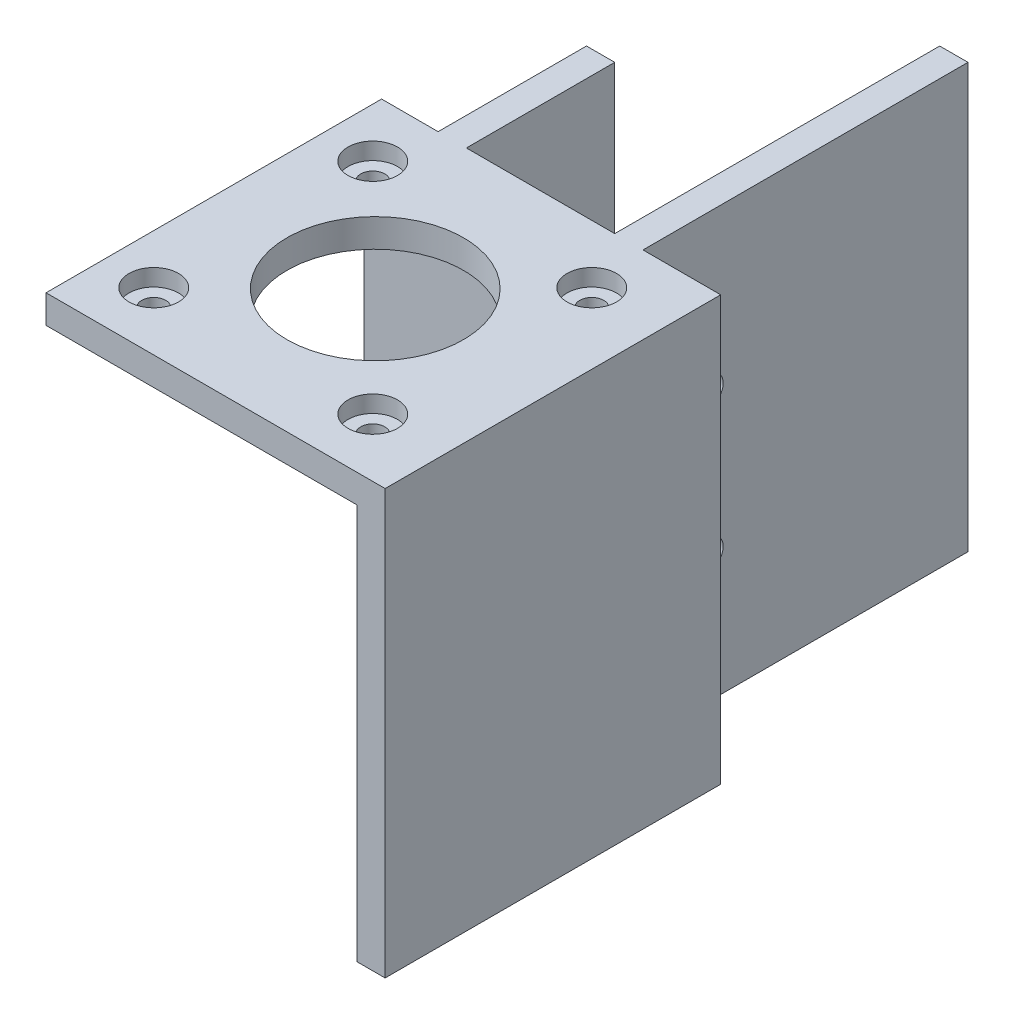
ISO-10303-21;
HEADER;
FILE_DESCRIPTION(('STEP AP214'),'2;1');
FILE_NAME('part.step','',(''),(''),'','','');
FILE_SCHEMA(('AUTOMOTIVE_DESIGN { 1 0 10303 214 1 1 1 1 }'));
ENDSEC;
DATA;
#1=APPLICATION_CONTEXT('core data for automotive mechanical design processes');
#2=APPLICATION_PROTOCOL_DEFINITION('international standard','automotive_design',2000,#1);
#3=PRODUCT_CONTEXT('',#1,'mechanical');
#4=PRODUCT('Part','Part','',(#3));
#5=PRODUCT_RELATED_PRODUCT_CATEGORY('part','',(#4));
#6=PRODUCT_DEFINITION_FORMATION('','',#4);
#7=PRODUCT_DEFINITION_CONTEXT('part definition',#1,'design');
#8=PRODUCT_DEFINITION('design','',#6,#7);
#9=PRODUCT_DEFINITION_SHAPE('','',#8);
#10=(LENGTH_UNIT() NAMED_UNIT(*) SI_UNIT(.MILLI.,.METRE.));
#11=(NAMED_UNIT(*) PLANE_ANGLE_UNIT() SI_UNIT($,.RADIAN.));
#12=(NAMED_UNIT(*) SI_UNIT($,.STERADIAN.) SOLID_ANGLE_UNIT());
#13=UNCERTAINTY_MEASURE_WITH_UNIT(LENGTH_MEASURE(1.E-05),#10,'distance_accuracy_value','');
#14=(GEOMETRIC_REPRESENTATION_CONTEXT(3) GLOBAL_UNCERTAINTY_ASSIGNED_CONTEXT((#13)) GLOBAL_UNIT_ASSIGNED_CONTEXT((#10,
#11,#12)) REPRESENTATION_CONTEXT('',''));
#15=CARTESIAN_POINT('',(0.,0.,0.));
#16=DIRECTION('',(0.,0.,1.));
#17=DIRECTION('',(1.,0.,0.));
#18=AXIS2_PLACEMENT_3D('',#15,#16,#17);
#19=CARTESIAN_POINT('',(0.,0.,0.));
#20=DIRECTION('',(0.,0.,1.));
#21=DIRECTION('',(1.,0.,0.));
#22=AXIS2_PLACEMENT_3D('',#19,#20,#21);
#23=PLANE('',#22);
#24=DIRECTION('',(1.,0.,0.));
#25=VECTOR('',#24,1.);
#26=CARTESIAN_POINT('',(-26.5243902439024,0.,0.));
#27=LINE('',#26,#25);
#28=CARTESIAN_POINT('',(-26.5243902439024,0.,0.));
#29=VERTEX_POINT('',#28);
#30=CARTESIAN_POINT('',(17.4756097560976,0.,0.));
#31=VERTEX_POINT('',#30);
#32=EDGE_CURVE('E48',#29,#31,#27,.T.);
#33=ORIENTED_EDGE('',*,*,#32,.T.);
#34=DIRECTION('',(0.,1.,0.));
#35=VECTOR('',#34,1.);
#36=CARTESIAN_POINT('',(17.4756097560976,0.,0.));
#37=LINE('',#36,#35);
#38=CARTESIAN_POINT('',(17.4756097560976,56.,0.));
#39=VERTEX_POINT('',#38);
#40=EDGE_CURVE('E175',#31,#39,#37,.T.);
#41=ORIENTED_EDGE('',*,*,#40,.T.);
#42=DIRECTION('',(1.,0.,0.));
#43=VECTOR('',#42,1.);
#44=CARTESIAN_POINT('',(-26.5243902439024,56.,0.));
#45=LINE('',#44,#43);
#46=CARTESIAN_POINT('',(-26.5243902439024,56.,0.));
#47=VERTEX_POINT('',#46);
#48=EDGE_CURVE('E314',#47,#39,#45,.T.);
#49=ORIENTED_EDGE('',*,*,#48,.F.);
#50=DIRECTION('',(0.,-1.,0.));
#51=VECTOR('',#50,1.);
#52=CARTESIAN_POINT('',(-26.5243902439024,60.,0.));
#53=LINE('',#52,#51);
#54=EDGE_CURVE('E330',#47,#29,#53,.T.);
#55=ORIENTED_EDGE('',*,*,#54,.T.);
#56=EDGE_LOOP('',(#33,#41,#49,#55));
#57=FACE_BOUND('',#56,.T.);
#58=ADVANCED_FACE('F33',(#57),#23,.T.);
#59=CARTESIAN_POINT('',(-26.5243902439024,56.,45.));
#60=DIRECTION('',(0.,1.,0.));
#61=DIRECTION('',(0.,0.,1.));
#62=AXIS2_PLACEMENT_3D('',#59,#60,#61);
#63=PLANE('',#62);
#64=CARTESIAN_POINT('',(-3.72439024390243,56.,21.2));
#65=DIRECTION('',(0.,1.,0.));
#66=DIRECTION('',(0.,0.,1.));
#67=AXIS2_PLACEMENT_3D('',#64,#65,#66);
#68=CIRCLE('',#67,12.5);
#69=CARTESIAN_POINT('',(-3.72439024390243,56.,33.7));
#70=VERTEX_POINT('',#69);
#71=EDGE_CURVE('E290',#70,#70,#68,.F.);
#72=ORIENTED_EDGE('',*,*,#71,.F.);
#73=EDGE_LOOP('',(#72));
#74=FACE_BOUND('',#73,.T.);
#75=CARTESIAN_POINT('',(-19.5243902439024,56.,5.75));
#76=DIRECTION('',(0.,1.,0.));
#77=DIRECTION('',(0.,0.,1.));
#78=AXIS2_PLACEMENT_3D('',#75,#76,#77);
#79=CIRCLE('',#78,1.7);
#80=CARTESIAN_POINT('',(-19.5243902439024,56.,7.45));
#81=VERTEX_POINT('',#80);
#82=EDGE_CURVE('E246',#81,#81,#79,.T.);
#83=ORIENTED_EDGE('',*,*,#82,.T.);
#84=EDGE_LOOP('',(#83));
#85=FACE_BOUND('',#84,.T.);
#86=CARTESIAN_POINT('',(11.4756097560976,56.,5.75));
#87=DIRECTION('',(0.,1.,0.));
#88=DIRECTION('',(0.,0.,1.));
#89=AXIS2_PLACEMENT_3D('',#86,#87,#88);
#90=CIRCLE('',#89,1.7);
#91=CARTESIAN_POINT('',(11.4756097560976,56.,7.45));
#92=VERTEX_POINT('',#91);
#93=EDGE_CURVE('E234',#92,#92,#90,.T.);
#94=ORIENTED_EDGE('',*,*,#93,.T.);
#95=EDGE_LOOP('',(#94));
#96=FACE_BOUND('',#95,.T.);
#97=CARTESIAN_POINT('',(-19.5243902439024,56.,36.75));
#98=DIRECTION('',(0.,1.,0.));
#99=DIRECTION('',(0.,0.,1.));
#100=AXIS2_PLACEMENT_3D('',#97,#98,#99);
#101=CIRCLE('',#100,1.7);
#102=CARTESIAN_POINT('',(-19.5243902439024,56.,38.45));
#103=VERTEX_POINT('',#102);
#104=EDGE_CURVE('E222',#103,#103,#101,.T.);
#105=ORIENTED_EDGE('',*,*,#104,.T.);
#106=EDGE_LOOP('',(#105));
#107=FACE_BOUND('',#106,.T.);
#108=CARTESIAN_POINT('',(11.4756097560976,56.,36.75));
#109=DIRECTION('',(0.,1.,0.));
#110=DIRECTION('',(0.,0.,1.));
#111=AXIS2_PLACEMENT_3D('',#108,#109,#110);
#112=CIRCLE('',#111,1.7);
#113=CARTESIAN_POINT('',(11.4756097560976,56.,38.45));
#114=VERTEX_POINT('',#113);
#115=EDGE_CURVE('E210',#114,#114,#112,.T.);
#116=ORIENTED_EDGE('',*,*,#115,.T.);
#117=EDGE_LOOP('',(#116));
#118=FACE_BOUND('',#117,.T.);
#119=DIRECTION('',(0.,0.,-1.));
#120=VECTOR('',#119,1.);
#121=CARTESIAN_POINT('',(17.4756097560976,56.,45.));
#122=LINE('',#121,#120);
#123=CARTESIAN_POINT('',(17.4756097560975,56.,45.));
#124=VERTEX_POINT('',#123);
#125=EDGE_CURVE('E56',#124,#39,#122,.T.);
#126=ORIENTED_EDGE('',*,*,#125,.F.);
#127=DIRECTION('',(1.,0.,0.));
#128=VECTOR('',#127,1.);
#129=CARTESIAN_POINT('',(-26.5243902439024,56.,45.));
#130=LINE('',#129,#128);
#131=CARTESIAN_POINT('',(-26.5243902439024,56.,45.));
#132=VERTEX_POINT('',#131);
#133=EDGE_CURVE('E322',#132,#124,#130,.T.);
#134=ORIENTED_EDGE('',*,*,#133,.F.);
#135=DIRECTION('',(0.,0.,-1.));
#136=VECTOR('',#135,1.);
#137=CARTESIAN_POINT('',(-26.5243902439024,56.,45.));
#138=LINE('',#137,#136);
#139=EDGE_CURVE('E326',#132,#47,#138,.T.);
#140=ORIENTED_EDGE('',*,*,#139,.T.);
#141=ORIENTED_EDGE('',*,*,#48,.T.);
#142=EDGE_LOOP('',(#126,#134,#140,#141));
#143=FACE_BOUND('',#142,.T.);
#144=ADVANCED_FACE('F357',(#74,#85,#96,#107,#118,#143),#63,.F.);
#145=CARTESIAN_POINT('',(-14.5243902439024,60.,-2.5));
#146=DIRECTION('',(-1.,0.,0.));
#147=DIRECTION('',(0.,0.,1.));
#148=AXIS2_PLACEMENT_3D('',#145,#146,#147);
#149=PLANE('',#148);
#150=DIRECTION('',(0.,0.,-1.));
#151=VECTOR('',#150,1.);
#152=CARTESIAN_POINT('',(-14.5243902439024,0.,-2.5));
#153=LINE('',#152,#151);
#154=CARTESIAN_POINT('',(-14.5243902439024,0.,-2.5));
#155=VERTEX_POINT('',#154);
#156=CARTESIAN_POINT('',(-14.5243902439024,0.,-23.5));
#157=VERTEX_POINT('',#156);
#158=EDGE_CURVE('E293',#155,#157,#153,.T.);
#159=ORIENTED_EDGE('',*,*,#158,.T.);
#160=DIRECTION('',(0.,-1.,0.));
#161=VECTOR('',#160,1.);
#162=CARTESIAN_POINT('',(-14.5243902439024,60.,-23.5));
#163=LINE('',#162,#161);
#164=CARTESIAN_POINT('',(-14.5243902439024,60.,-23.5));
#165=VERTEX_POINT('',#164);
#166=EDGE_CURVE('E304',#165,#157,#163,.T.);
#167=ORIENTED_EDGE('',*,*,#166,.F.);
#168=DIRECTION('',(0.,0.,-1.));
#169=VECTOR('',#168,1.);
#170=CARTESIAN_POINT('',(-14.5243902439024,60.,-2.5));
#171=LINE('',#170,#169);
#172=CARTESIAN_POINT('',(-14.5243902439024,60.,-2.5));
#173=VERTEX_POINT('',#172);
#174=EDGE_CURVE('E294',#173,#165,#171,.T.);
#175=ORIENTED_EDGE('',*,*,#174,.F.);
#176=DIRECTION('',(0.,-1.,0.));
#177=VECTOR('',#176,1.);
#178=CARTESIAN_POINT('',(-14.5243902439024,60.,-2.5));
#179=LINE('',#178,#177);
#180=EDGE_CURVE('E312',#173,#155,#179,.T.);
#181=ORIENTED_EDGE('',*,*,#180,.T.);
#182=EDGE_LOOP('',(#159,#167,#175,#181));
#183=FACE_BOUND('',#182,.T.);
#184=CARTESIAN_POINT('',(-14.5243902439024,18.,-11.75));
#185=DIRECTION('',(-1.,0.,0.));
#186=DIRECTION('',(0.,0.,1.));
#187=AXIS2_PLACEMENT_3D('',#184,#185,#186);
#188=CIRCLE('',#187,2.1);
#189=CARTESIAN_POINT('',(-14.5243902439024,18.,-9.65));
#190=VERTEX_POINT('',#189);
#191=EDGE_CURVE('E189',#190,#190,#188,.F.);
#192=ORIENTED_EDGE('',*,*,#191,.F.);
#193=EDGE_LOOP('',(#192));
#194=FACE_BOUND('',#193,.T.);
#195=CARTESIAN_POINT('',(-14.5243902439024,38.,-11.75));
#196=DIRECTION('',(-1.,0.,0.));
#197=DIRECTION('',(0.,0.,1.));
#198=AXIS2_PLACEMENT_3D('',#195,#196,#197);
#199=CIRCLE('',#198,2.1);
#200=CARTESIAN_POINT('',(-14.5243902439024,38.,-9.65));
#201=VERTEX_POINT('',#200);
#202=EDGE_CURVE('E198',#201,#201,#199,.T.);
#203=ORIENTED_EDGE('',*,*,#202,.T.);
#204=EDGE_LOOP('',(#203));
#205=FACE_BOUND('',#204,.T.);
#206=ADVANCED_FACE('F362',(#183,#194,#205),#149,.F.);
#207=CARTESIAN_POINT('',(6.47560975609757,60.,-2.5));
#208=DIRECTION('',(1.,0.,0.));
#209=DIRECTION('',(0.,0.,-1.));
#210=AXIS2_PLACEMENT_3D('',#207,#208,#209);
#211=PLANE('',#210);
#212=DIRECTION('',(0.,0.,1.));
#213=VECTOR('',#212,1.);
#214=CARTESIAN_POINT('',(6.47560975609757,0.,-2.5));
#215=LINE('',#214,#213);
#216=CARTESIAN_POINT('',(6.47560975609756,0.,-48.5));
#217=VERTEX_POINT('',#216);
#218=CARTESIAN_POINT('',(6.47560975609757,0.,-2.5));
#219=VERTEX_POINT('',#218);
#220=EDGE_CURVE('E307',#217,#219,#215,.T.);
#221=ORIENTED_EDGE('',*,*,#220,.T.);
#222=DIRECTION('',(0.,-1.,0.));
#223=VECTOR('',#222,1.);
#224=CARTESIAN_POINT('',(6.47560975609757,60.,-2.5));
#225=LINE('',#224,#223);
#226=CARTESIAN_POINT('',(6.47560975609757,60.,-2.5));
#227=VERTEX_POINT('',#226);
#228=EDGE_CURVE('E315',#227,#219,#225,.T.);
#229=ORIENTED_EDGE('',*,*,#228,.F.);
#230=DIRECTION('',(0.,0.,1.));
#231=VECTOR('',#230,1.);
#232=CARTESIAN_POINT('',(6.47560975609757,60.,-2.5));
#233=LINE('',#232,#231);
#234=CARTESIAN_POINT('',(6.47560975609756,60.,-48.5));
#235=VERTEX_POINT('',#234);
#236=EDGE_CURVE('E297',#235,#227,#233,.T.);
#237=ORIENTED_EDGE('',*,*,#236,.F.);
#238=DIRECTION('',(0.,1.,0.));
#239=VECTOR('',#238,1.);
#240=CARTESIAN_POINT('',(6.47560975609756,60.,-48.5));
#241=LINE('',#240,#239);
#242=EDGE_CURVE('E249',#217,#235,#241,.T.);
#243=ORIENTED_EDGE('',*,*,#242,.F.);
#244=EDGE_LOOP('',(#221,#229,#237,#243));
#245=FACE_BOUND('',#244,.T.);
#246=CARTESIAN_POINT('',(6.47560975609757,18.,-11.75));
#247=DIRECTION('',(1.,0.,0.));
#248=DIRECTION('',(0.,0.,-1.));
#249=AXIS2_PLACEMENT_3D('',#246,#247,#248);
#250=CIRCLE('',#249,2.1);
#251=CARTESIAN_POINT('',(6.47560975609757,18.,-13.85));
#252=VERTEX_POINT('',#251);
#253=EDGE_CURVE('E186',#252,#252,#250,.F.);
#254=ORIENTED_EDGE('',*,*,#253,.F.);
#255=EDGE_LOOP('',(#254));
#256=FACE_BOUND('',#255,.T.);
#257=CARTESIAN_POINT('',(6.47560975609757,38.,-11.75));
#258=DIRECTION('',(1.,0.,0.));
#259=DIRECTION('',(0.,0.,-1.));
#260=AXIS2_PLACEMENT_3D('',#257,#258,#259);
#261=CIRCLE('',#260,2.1);
#262=CARTESIAN_POINT('',(6.47560975609757,38.,-13.85));
#263=VERTEX_POINT('',#262);
#264=EDGE_CURVE('E195',#263,#263,#261,.T.);
#265=ORIENTED_EDGE('',*,*,#264,.T.);
#266=EDGE_LOOP('',(#265));
#267=FACE_BOUND('',#266,.T.);
#268=ADVANCED_FACE('F414',(#245,#256,#267),#211,.F.);
#269=CARTESIAN_POINT('',(10.4756097560976,0.,0.));
#270=DIRECTION('',(1.,0.,0.));
#271=DIRECTION('',(0.,1.,0.));
#272=AXIS2_PLACEMENT_3D('',#269,#270,#271);
#273=PLANE('',#272);
#274=CARTESIAN_POINT('',(10.4756097560976,18.,-11.75));
#275=DIRECTION('',(1.,0.,0.));
#276=DIRECTION('',(0.,1.,0.));
#277=AXIS2_PLACEMENT_3D('',#274,#275,#276);
#278=CIRCLE('',#277,2.1);
#279=CARTESIAN_POINT('',(10.4756097560976,20.1,-11.75));
#280=VERTEX_POINT('',#279);
#281=EDGE_CURVE('E181',#280,#280,#278,.F.);
#282=ORIENTED_EDGE('',*,*,#281,.T.);
#283=EDGE_LOOP('',(#282));
#284=FACE_BOUND('',#283,.T.);
#285=DIRECTION('',(0.,0.,-1.));
#286=VECTOR('',#285,1.);
#287=CARTESIAN_POINT('',(10.4756097560976,60.,-2.5));
#288=LINE('',#287,#286);
#289=CARTESIAN_POINT('',(10.4756097560976,60.,-2.5));
#290=VERTEX_POINT('',#289);
#291=CARTESIAN_POINT('',(10.4756097560975,60.,-48.5));
#292=VERTEX_POINT('',#291);
#293=EDGE_CURVE('E276',#290,#292,#288,.T.);
#294=ORIENTED_EDGE('',*,*,#293,.F.);
#295=DIRECTION('',(0.,1.,0.));
#296=VECTOR('',#295,1.);
#297=CARTESIAN_POINT('',(10.4756097560976,0.,-2.5));
#298=LINE('',#297,#296);
#299=CARTESIAN_POINT('',(10.4756097560976,0.,-2.5));
#300=VERTEX_POINT('',#299);
#301=EDGE_CURVE('E282',#300,#290,#298,.T.);
#302=ORIENTED_EDGE('',*,*,#301,.F.);
#303=DIRECTION('',(0.,0.,-1.));
#304=VECTOR('',#303,1.);
#305=CARTESIAN_POINT('',(10.4756097560976,0.,-2.5));
#306=LINE('',#305,#304);
#307=CARTESIAN_POINT('',(10.4756097560975,0.,-48.5));
#308=VERTEX_POINT('',#307);
#309=EDGE_CURVE('E280',#300,#308,#306,.T.);
#310=ORIENTED_EDGE('',*,*,#309,.T.);
#311=DIRECTION('',(0.,-1.,0.));
#312=VECTOR('',#311,1.);
#313=CARTESIAN_POINT('',(10.4756097560975,60.,-48.5));
#314=LINE('',#313,#312);
#315=EDGE_CURVE('E255',#292,#308,#314,.T.);
#316=ORIENTED_EDGE('',*,*,#315,.F.);
#317=EDGE_LOOP('',(#294,#302,#310,#316));
#318=FACE_BOUND('',#317,.T.);
#319=CARTESIAN_POINT('',(10.4756097560976,38.,-11.75));
#320=DIRECTION('',(1.,0.,0.));
#321=DIRECTION('',(0.,1.,0.));
#322=AXIS2_PLACEMENT_3D('',#319,#320,#321);
#323=CIRCLE('',#322,2.1);
#324=CARTESIAN_POINT('',(10.4756097560976,40.1,-11.75));
#325=VERTEX_POINT('',#324);
#326=EDGE_CURVE('E192',#325,#325,#323,.T.);
#327=ORIENTED_EDGE('',*,*,#326,.F.);
#328=EDGE_LOOP('',(#327));
#329=FACE_BOUND('',#328,.T.);
#330=ADVANCED_FACE('F407',(#284,#318,#329),#273,.T.);
#331=CARTESIAN_POINT('',(-18.5243902439024,0.,0.));
#332=DIRECTION('',(-1.,0.,0.));
#333=DIRECTION('',(0.,-1.,0.));
#334=AXIS2_PLACEMENT_3D('',#331,#332,#333);
#335=PLANE('',#334);
#336=CARTESIAN_POINT('',(-18.5243902439024,18.,-11.75));
#337=DIRECTION('',(1.,0.,0.));
#338=DIRECTION('',(0.,1.,0.));
#339=AXIS2_PLACEMENT_3D('',#336,#337,#338);
#340=CIRCLE('',#339,2.1);
#341=CARTESIAN_POINT('',(-18.5243902439024,20.1,-11.75));
#342=VERTEX_POINT('',#341);
#343=EDGE_CURVE('E177',#342,#342,#340,.T.);
#344=ORIENTED_EDGE('',*,*,#343,.T.);
#345=EDGE_LOOP('',(#344));
#346=FACE_BOUND('',#345,.T.);
#347=DIRECTION('',(0.,-1.,0.));
#348=VECTOR('',#347,1.);
#349=CARTESIAN_POINT('',(-18.5243902439024,0.,-2.5));
#350=LINE('',#349,#348);
#351=CARTESIAN_POINT('',(-18.5243902439024,60.,-2.5));
#352=VERTEX_POINT('',#351);
#353=CARTESIAN_POINT('',(-18.5243902439024,0.,-2.5));
#354=VERTEX_POINT('',#353);
#355=EDGE_CURVE('E262',#352,#354,#350,.T.);
#356=ORIENTED_EDGE('',*,*,#355,.F.);
#357=DIRECTION('',(0.,0.,-1.));
#358=VECTOR('',#357,1.);
#359=CARTESIAN_POINT('',(-18.5243902439024,60.,0.));
#360=LINE('',#359,#358);
#361=CARTESIAN_POINT('',(-18.5243902439024,60.,-23.5));
#362=VERTEX_POINT('',#361);
#363=EDGE_CURVE('E264',#352,#362,#360,.T.);
#364=ORIENTED_EDGE('',*,*,#363,.T.);
#365=DIRECTION('',(0.,-1.,0.));
#366=VECTOR('',#365,1.);
#367=CARTESIAN_POINT('',(-18.5243902439024,0.,-23.5));
#368=LINE('',#367,#366);
#369=CARTESIAN_POINT('',(-18.5243902439024,0.,-23.5));
#370=VERTEX_POINT('',#369);
#371=EDGE_CURVE('E266',#362,#370,#368,.T.);
#372=ORIENTED_EDGE('',*,*,#371,.T.);
#373=DIRECTION('',(0.,0.,1.));
#374=VECTOR('',#373,1.);
#375=CARTESIAN_POINT('',(-18.5243902439024,0.,0.));
#376=LINE('',#375,#374);
#377=EDGE_CURVE('E268',#370,#354,#376,.T.);
#378=ORIENTED_EDGE('',*,*,#377,.T.);
#379=EDGE_LOOP('',(#356,#364,#372,#378));
#380=FACE_BOUND('',#379,.T.);
#381=CARTESIAN_POINT('',(-18.5243902439024,38.,-11.75));
#382=DIRECTION('',(-1.,0.,0.));
#383=DIRECTION('',(0.,-1.,0.));
#384=AXIS2_PLACEMENT_3D('',#381,#382,#383);
#385=CIRCLE('',#384,2.1);
#386=CARTESIAN_POINT('',(-18.5243902439024,35.9,-11.75));
#387=VERTEX_POINT('',#386);
#388=EDGE_CURVE('E178',#387,#387,#385,.T.);
#389=ORIENTED_EDGE('',*,*,#388,.F.);
#390=EDGE_LOOP('',(#389));
#391=FACE_BOUND('',#390,.T.);
#392=ADVANCED_FACE('F370',(#346,#380,#391),#335,.T.);
#393=CARTESIAN_POINT('',(-26.5243902439024,60.,-23.5));
#394=DIRECTION('',(0.,1.,0.));
#395=DIRECTION('',(0.,0.,1.));
#396=AXIS2_PLACEMENT_3D('',#393,#394,#395);
#397=PLANE('',#396);
#398=DIRECTION('',(0.,0.,1.));
#399=VECTOR('',#398,1.);
#400=CARTESIAN_POINT('',(21.4756097560976,60.,45.));
#401=LINE('',#400,#399);
#402=CARTESIAN_POINT('',(21.4756097560976,60.,-2.5));
#403=VERTEX_POINT('',#402);
#404=CARTESIAN_POINT('',(21.4756097560976,60.,45.));
#405=VERTEX_POINT('',#404);
#406=EDGE_CURVE('E167',#403,#405,#401,.T.);
#407=ORIENTED_EDGE('',*,*,#406,.F.);
#408=DIRECTION('',(1.,0.,0.));
#409=VECTOR('',#408,1.);
#410=CARTESIAN_POINT('',(10.4756097560976,60.,-2.5));
#411=LINE('',#410,#409);
#412=EDGE_CURVE('E284',#290,#403,#411,.T.);
#413=ORIENTED_EDGE('',*,*,#412,.F.);
#414=ORIENTED_EDGE('',*,*,#293,.T.);
#415=DIRECTION('',(1.,0.,0.));
#416=VECTOR('',#415,1.);
#417=CARTESIAN_POINT('',(6.47560975609756,60.,-48.5));
#418=LINE('',#417,#416);
#419=EDGE_CURVE('E252',#235,#292,#418,.T.);
#420=ORIENTED_EDGE('',*,*,#419,.F.);
#421=ORIENTED_EDGE('',*,*,#236,.T.);
#422=DIRECTION('',(-1.,0.,0.));
#423=VECTOR('',#422,1.);
#424=CARTESIAN_POINT('',(-14.5243902439024,60.,-2.5));
#425=LINE('',#424,#423);
#426=EDGE_CURVE('E301',#227,#173,#425,.T.);
#427=ORIENTED_EDGE('',*,*,#426,.T.);
#428=ORIENTED_EDGE('',*,*,#174,.T.);
#429=DIRECTION('',(-1.,0.,0.));
#430=VECTOR('',#429,1.);
#431=CARTESIAN_POINT('',(-26.5243902439024,60.,-23.5));
#432=LINE('',#431,#430);
#433=EDGE_CURVE('E333',#165,#362,#432,.T.);
#434=ORIENTED_EDGE('',*,*,#433,.T.);
#435=ORIENTED_EDGE('',*,*,#363,.F.);
#436=DIRECTION('',(-1.,0.,0.));
#437=VECTOR('',#436,1.);
#438=CARTESIAN_POINT('',(-18.5243902439024,60.,-2.5));
#439=LINE('',#438,#437);
#440=CARTESIAN_POINT('',(-26.5243902439024,60.,-2.5));
#441=VERTEX_POINT('',#440);
#442=EDGE_CURVE('E271',#352,#441,#439,.T.);
#443=ORIENTED_EDGE('',*,*,#442,.T.);
#444=DIRECTION('',(0.,0.,1.));
#445=VECTOR('',#444,1.);
#446=CARTESIAN_POINT('',(-26.5243902439024,60.,-23.5));
#447=LINE('',#446,#445);
#448=CARTESIAN_POINT('',(-26.5243902439024,60.,45.));
#449=VERTEX_POINT('',#448);
#450=EDGE_CURVE('E11',#441,#449,#447,.T.);
#451=ORIENTED_EDGE('',*,*,#450,.T.);
#452=DIRECTION('',(-1.,0.,0.));
#453=VECTOR('',#452,1.);
#454=CARTESIAN_POINT('',(-26.5243902439024,60.,45.));
#455=LINE('',#454,#453);
#456=EDGE_CURVE('E324',#405,#449,#455,.T.);
#457=ORIENTED_EDGE('',*,*,#456,.F.);
#458=EDGE_LOOP('',(#407,#413,#414,#420,#421,#427,#428,#434,#435,#443,#451,#457));
#459=FACE_BOUND('',#458,.T.);
#460=CARTESIAN_POINT('',(11.4756097560976,60.,36.75));
#461=DIRECTION('',(0.,1.,0.));
#462=DIRECTION('',(0.,0.,1.));
#463=AXIS2_PLACEMENT_3D('',#460,#461,#462);
#464=CIRCLE('',#463,3.5);
#465=CARTESIAN_POINT('',(11.4756097560976,60.,40.25));
#466=VERTEX_POINT('',#465);
#467=EDGE_CURVE('E201',#466,#466,#464,.T.);
#468=ORIENTED_EDGE('',*,*,#467,.F.);
#469=EDGE_LOOP('',(#468));
#470=FACE_BOUND('',#469,.T.);
#471=CARTESIAN_POINT('',(-19.5243902439024,60.,36.75));
#472=DIRECTION('',(0.,1.,0.));
#473=DIRECTION('',(0.,0.,1.));
#474=AXIS2_PLACEMENT_3D('',#471,#472,#473);
#475=CIRCLE('',#474,3.5);
#476=CARTESIAN_POINT('',(-19.5243902439024,60.,40.25));
#477=VERTEX_POINT('',#476);
#478=EDGE_CURVE('E213',#477,#477,#475,.T.);
#479=ORIENTED_EDGE('',*,*,#478,.F.);
#480=EDGE_LOOP('',(#479));
#481=FACE_BOUND('',#480,.T.);
#482=CARTESIAN_POINT('',(11.4756097560976,60.,5.75));
#483=DIRECTION('',(0.,1.,0.));
#484=DIRECTION('',(0.,0.,1.));
#485=AXIS2_PLACEMENT_3D('',#482,#483,#484);
#486=CIRCLE('',#485,3.5);
#487=CARTESIAN_POINT('',(11.4756097560976,60.,9.25));
#488=VERTEX_POINT('',#487);
#489=EDGE_CURVE('E225',#488,#488,#486,.T.);
#490=ORIENTED_EDGE('',*,*,#489,.F.);
#491=EDGE_LOOP('',(#490));
#492=FACE_BOUND('',#491,.T.);
#493=CARTESIAN_POINT('',(-19.5243902439024,60.,5.75));
#494=DIRECTION('',(0.,1.,0.));
#495=DIRECTION('',(0.,0.,1.));
#496=AXIS2_PLACEMENT_3D('',#493,#494,#495);
#497=CIRCLE('',#496,3.5);
#498=CARTESIAN_POINT('',(-19.5243902439024,60.,9.25));
#499=VERTEX_POINT('',#498);
#500=EDGE_CURVE('E237',#499,#499,#497,.T.);
#501=ORIENTED_EDGE('',*,*,#500,.F.);
#502=EDGE_LOOP('',(#501));
#503=FACE_BOUND('',#502,.T.);
#504=CARTESIAN_POINT('',(-3.72439024390243,60.,21.2));
#505=DIRECTION('',(0.,1.,0.));
#506=DIRECTION('',(0.,0.,1.));
#507=AXIS2_PLACEMENT_3D('',#504,#505,#506);
#508=CIRCLE('',#507,12.5);
#509=CARTESIAN_POINT('',(-3.72439024390243,60.,33.7));
#510=VERTEX_POINT('',#509);
#511=EDGE_CURVE('E287',#510,#510,#508,.T.);
#512=ORIENTED_EDGE('',*,*,#511,.F.);
#513=EDGE_LOOP('',(#512));
#514=FACE_BOUND('',#513,.T.);
#515=ADVANCED_FACE('F368',(#459,#470,#481,#492,#503,#514),#397,.T.);
#516=CARTESIAN_POINT('',(-26.5243902439024,0.,-23.5));
#517=DIRECTION('',(0.,-1.,0.));
#518=DIRECTION('',(0.,0.,-1.));
#519=AXIS2_PLACEMENT_3D('',#516,#517,#518);
#520=PLANE('',#519);
#521=DIRECTION('',(0.,0.,-1.));
#522=VECTOR('',#521,1.);
#523=CARTESIAN_POINT('',(17.4756097560976,0.,45.));
#524=LINE('',#523,#522);
#525=CARTESIAN_POINT('',(17.4756097560976,0.,45.));
#526=VERTEX_POINT('',#525);
#527=EDGE_CURVE('E152',#526,#31,#524,.T.);
#528=ORIENTED_EDGE('',*,*,#527,.T.);
#529=ORIENTED_EDGE('',*,*,#32,.F.);
#530=DIRECTION('',(0.,0.,1.));
#531=VECTOR('',#530,1.);
#532=CARTESIAN_POINT('',(-26.5243902439024,0.,-23.5));
#533=LINE('',#532,#531);
#534=CARTESIAN_POINT('',(-26.5243902439024,0.,-2.5));
#535=VERTEX_POINT('',#534);
#536=EDGE_CURVE('E37',#535,#29,#533,.T.);
#537=ORIENTED_EDGE('',*,*,#536,.F.);
#538=DIRECTION('',(-1.,0.,0.));
#539=VECTOR('',#538,1.);
#540=CARTESIAN_POINT('',(-18.5243902439024,0.,-2.5));
#541=LINE('',#540,#539);
#542=EDGE_CURVE('E274',#354,#535,#541,.T.);
#543=ORIENTED_EDGE('',*,*,#542,.F.);
#544=ORIENTED_EDGE('',*,*,#377,.F.);
#545=DIRECTION('',(1.,0.,0.));
#546=VECTOR('',#545,1.);
#547=CARTESIAN_POINT('',(-26.5243902439024,0.,-23.5));
#548=LINE('',#547,#546);
#549=EDGE_CURVE('E331',#370,#157,#548,.T.);
#550=ORIENTED_EDGE('',*,*,#549,.T.);
#551=ORIENTED_EDGE('',*,*,#158,.F.);
#552=DIRECTION('',(-1.,0.,0.));
#553=VECTOR('',#552,1.);
#554=CARTESIAN_POINT('',(-14.5243902439024,0.,-2.5));
#555=LINE('',#554,#553);
#556=EDGE_CURVE('E298',#219,#155,#555,.T.);
#557=ORIENTED_EDGE('',*,*,#556,.F.);
#558=ORIENTED_EDGE('',*,*,#220,.F.);
#559=DIRECTION('',(-1.,0.,0.));
#560=VECTOR('',#559,1.);
#561=CARTESIAN_POINT('',(6.47560975609756,0.,-48.5));
#562=LINE('',#561,#560);
#563=EDGE_CURVE('E258',#308,#217,#562,.T.);
#564=ORIENTED_EDGE('',*,*,#563,.F.);
#565=ORIENTED_EDGE('',*,*,#309,.F.);
#566=DIRECTION('',(1.,0.,0.));
#567=VECTOR('',#566,1.);
#568=CARTESIAN_POINT('',(10.4756097560976,0.,-2.5));
#569=LINE('',#568,#567);
#570=CARTESIAN_POINT('',(21.4756097560976,0.,-2.5));
#571=VERTEX_POINT('',#570);
#572=EDGE_CURVE('E158',#300,#571,#569,.T.);
#573=ORIENTED_EDGE('',*,*,#572,.T.);
#574=DIRECTION('',(0.,0.,-1.));
#575=VECTOR('',#574,1.);
#576=CARTESIAN_POINT('',(21.4756097560976,0.,45.));
#577=LINE('',#576,#575);
#578=CARTESIAN_POINT('',(21.4756097560976,0.,45.));
#579=VERTEX_POINT('',#578);
#580=EDGE_CURVE('E155',#579,#571,#577,.T.);
#581=ORIENTED_EDGE('',*,*,#580,.F.);
#582=DIRECTION('',(1.,0.,0.));
#583=VECTOR('',#582,1.);
#584=CARTESIAN_POINT('',(17.4756097560976,0.,45.));
#585=LINE('',#584,#583);
#586=EDGE_CURVE('E142',#526,#579,#585,.T.);
#587=ORIENTED_EDGE('',*,*,#586,.F.);
#588=EDGE_LOOP('',(#528,#529,#537,#543,#544,#550,#551,#557,#558,#564,#565,#573,#581,#587));
#589=FACE_BOUND('',#588,.T.);
#590=ADVANCED_FACE('F156',(#589),#520,.T.);
#591=CARTESIAN_POINT('',(0.,0.,-23.5));
#592=DIRECTION('',(0.,0.,1.));
#593=DIRECTION('',(1.,0.,0.));
#594=AXIS2_PLACEMENT_3D('',#591,#592,#593);
#595=PLANE('',#594);
#596=ORIENTED_EDGE('',*,*,#371,.F.);
#597=ORIENTED_EDGE('',*,*,#433,.F.);
#598=ORIENTED_EDGE('',*,*,#166,.T.);
#599=ORIENTED_EDGE('',*,*,#549,.F.);
#600=EDGE_LOOP('',(#596,#597,#598,#599));
#601=FACE_BOUND('',#600,.T.);
#602=ADVANCED_FACE('F367',(#601),#595,.F.);
#603=CARTESIAN_POINT('',(-26.5243902439024,60.,-23.5));
#604=DIRECTION('',(-1.,0.,0.));
#605=DIRECTION('',(0.,-1.,0.));
#606=AXIS2_PLACEMENT_3D('',#603,#604,#605);
#607=PLANE('',#606);
#608=ORIENTED_EDGE('',*,*,#450,.F.);
#609=DIRECTION('',(0.,-1.,0.));
#610=VECTOR('',#609,1.);
#611=CARTESIAN_POINT('',(-26.5243902439024,0.,-2.5));
#612=LINE('',#611,#610);
#613=EDGE_CURVE('E261',#441,#535,#612,.T.);
#614=ORIENTED_EDGE('',*,*,#613,.T.);
#615=ORIENTED_EDGE('',*,*,#536,.T.);
#616=ORIENTED_EDGE('',*,*,#54,.F.);
#617=ORIENTED_EDGE('',*,*,#139,.F.);
#618=DIRECTION('',(0.,-1.,0.));
#619=VECTOR('',#618,1.);
#620=CARTESIAN_POINT('',(-26.5243902439024,60.,45.));
#621=LINE('',#620,#619);
#622=EDGE_CURVE('E319',#449,#132,#621,.T.);
#623=ORIENTED_EDGE('',*,*,#622,.F.);
#624=EDGE_LOOP('',(#608,#614,#615,#616,#617,#623));
#625=FACE_BOUND('',#624,.T.);
#626=ADVANCED_FACE('F35',(#625),#607,.T.);
#627=CARTESIAN_POINT('',(0.,0.,45.));
#628=DIRECTION('',(0.,0.,1.));
#629=DIRECTION('',(1.,0.,0.));
#630=AXIS2_PLACEMENT_3D('',#627,#628,#629);
#631=PLANE('',#630);
#632=DIRECTION('',(0.,-1.,0.));
#633=VECTOR('',#632,1.);
#634=CARTESIAN_POINT('',(21.4756097560976,60.,45.));
#635=LINE('',#634,#633);
#636=EDGE_CURVE('E146',#405,#579,#635,.T.);
#637=ORIENTED_EDGE('',*,*,#636,.F.);
#638=ORIENTED_EDGE('',*,*,#456,.T.);
#639=ORIENTED_EDGE('',*,*,#622,.T.);
#640=ORIENTED_EDGE('',*,*,#133,.T.);
#641=DIRECTION('',(0.,-1.,0.));
#642=VECTOR('',#641,1.);
#643=CARTESIAN_POINT('',(17.4756097560976,60.,45.));
#644=LINE('',#643,#642);
#645=EDGE_CURVE('E148',#124,#526,#644,.T.);
#646=ORIENTED_EDGE('',*,*,#645,.T.);
#647=ORIENTED_EDGE('',*,*,#586,.T.);
#648=EDGE_LOOP('',(#637,#638,#639,#640,#646,#647));
#649=FACE_BOUND('',#648,.T.);
#650=ADVANCED_FACE('F144',(#649),#631,.T.);
#651=CARTESIAN_POINT('',(-14.5243902439024,60.,-2.5));
#652=DIRECTION('',(0.,0.,1.));
#653=DIRECTION('',(1.,0.,0.));
#654=AXIS2_PLACEMENT_3D('',#651,#652,#653);
#655=PLANE('',#654);
#656=ORIENTED_EDGE('',*,*,#556,.T.);
#657=ORIENTED_EDGE('',*,*,#180,.F.);
#658=ORIENTED_EDGE('',*,*,#426,.F.);
#659=ORIENTED_EDGE('',*,*,#228,.T.);
#660=EDGE_LOOP('',(#656,#657,#658,#659));
#661=FACE_BOUND('',#660,.T.);
#662=ADVANCED_FACE('F417',(#661),#655,.F.);
#663=CARTESIAN_POINT('',(-3.72439024390243,-0.001000000000001,21.2));
#664=DIRECTION('',(0.,1.,0.));
#665=DIRECTION('',(0.,0.,1.));
#666=AXIS2_PLACEMENT_3D('',#663,#664,#665);
#667=CYLINDRICAL_SURFACE('',#666,12.5);
#668=ORIENTED_EDGE('',*,*,#511,.T.);
#669=EDGE_LOOP('',(#668));
#670=FACE_BOUND('',#669,.T.);
#671=ORIENTED_EDGE('',*,*,#71,.T.);
#672=EDGE_LOOP('',(#671));
#673=FACE_BOUND('',#672,.T.);
#674=ADVANCED_FACE('F419',(#670,#673),#667,.F.);
#675=CARTESIAN_POINT('',(10.4756097560976,0.,-2.5));
#676=DIRECTION('',(0.,0.,-1.));
#677=DIRECTION('',(-1.,0.,0.));
#678=AXIS2_PLACEMENT_3D('',#675,#676,#677);
#679=PLANE('',#678);
#680=DIRECTION('',(0.,1.,0.));
#681=VECTOR('',#680,1.);
#682=CARTESIAN_POINT('',(21.4756097560976,60.,-2.5));
#683=LINE('',#682,#681);
#684=EDGE_CURVE('E162',#571,#403,#683,.T.);
#685=ORIENTED_EDGE('',*,*,#684,.F.);
#686=ORIENTED_EDGE('',*,*,#572,.F.);
#687=ORIENTED_EDGE('',*,*,#301,.T.);
#688=ORIENTED_EDGE('',*,*,#412,.T.);
#689=EDGE_LOOP('',(#685,#686,#687,#688));
#690=FACE_BOUND('',#689,.T.);
#691=ADVANCED_FACE('F403',(#690),#679,.T.);
#692=CARTESIAN_POINT('',(-18.5243902439024,0.,-2.5));
#693=DIRECTION('',(0.,0.,-1.));
#694=DIRECTION('',(-1.,0.,0.));
#695=AXIS2_PLACEMENT_3D('',#692,#693,#694);
#696=PLANE('',#695);
#697=ORIENTED_EDGE('',*,*,#613,.F.);
#698=ORIENTED_EDGE('',*,*,#442,.F.);
#699=ORIENTED_EDGE('',*,*,#355,.T.);
#700=ORIENTED_EDGE('',*,*,#542,.T.);
#701=EDGE_LOOP('',(#697,#698,#699,#700));
#702=FACE_BOUND('',#701,.T.);
#703=ADVANCED_FACE('F396',(#702),#696,.T.);
#704=CARTESIAN_POINT('',(0.,0.,-48.5));
#705=DIRECTION('',(0.,0.,1.));
#706=DIRECTION('',(1.,0.,0.));
#707=AXIS2_PLACEMENT_3D('',#704,#705,#706);
#708=PLANE('',#707);
#709=ORIENTED_EDGE('',*,*,#242,.T.);
#710=ORIENTED_EDGE('',*,*,#419,.T.);
#711=ORIENTED_EDGE('',*,*,#315,.T.);
#712=ORIENTED_EDGE('',*,*,#563,.T.);
#713=EDGE_LOOP('',(#709,#710,#711,#712));
#714=FACE_BOUND('',#713,.T.);
#715=ADVANCED_FACE('F411',(#714),#708,.F.);
#716=CARTESIAN_POINT('',(-19.5243902439024,60.,5.75));
#717=DIRECTION('',(0.,1.,0.));
#718=DIRECTION('',(0.,0.,1.));
#719=AXIS2_PLACEMENT_3D('',#716,#717,#718);
#720=CYLINDRICAL_SURFACE('',#719,1.7);
#721=ORIENTED_EDGE('',*,*,#82,.F.);
#722=EDGE_LOOP('',(#721));
#723=FACE_BOUND('',#722,.T.);
#724=CARTESIAN_POINT('',(-19.5243902439024,57.6,5.75));
#725=DIRECTION('',(0.,1.,0.));
#726=DIRECTION('',(0.,0.,1.));
#727=AXIS2_PLACEMENT_3D('',#724,#725,#726);
#728=CIRCLE('',#727,1.7);
#729=CARTESIAN_POINT('',(-19.5243902439024,57.6,7.45));
#730=VERTEX_POINT('',#729);
#731=EDGE_CURVE('E243',#730,#730,#728,.T.);
#732=ORIENTED_EDGE('',*,*,#731,.T.);
#733=EDGE_LOOP('',(#732));
#734=FACE_BOUND('',#733,.T.);
#735=ADVANCED_FACE('F512',(#723,#734),#720,.F.);
#736=CARTESIAN_POINT('',(-17.8243902439024,57.6,5.75));
#737=DIRECTION('',(0.,-1.,0.));
#738=DIRECTION('',(0.,0.,-1.));
#739=AXIS2_PLACEMENT_3D('',#736,#737,#738);
#740=PLANE('',#739);
#741=ORIENTED_EDGE('',*,*,#731,.F.);
#742=EDGE_LOOP('',(#741));
#743=FACE_BOUND('',#742,.T.);
#744=CARTESIAN_POINT('',(-19.5243902439024,57.6,5.75));
#745=DIRECTION('',(0.,1.,0.));
#746=DIRECTION('',(0.,0.,1.));
#747=AXIS2_PLACEMENT_3D('',#744,#745,#746);
#748=CIRCLE('',#747,3.5);
#749=CARTESIAN_POINT('',(-19.5243902439024,57.6,9.25));
#750=VERTEX_POINT('',#749);
#751=EDGE_CURVE('E240',#750,#750,#748,.T.);
#752=ORIENTED_EDGE('',*,*,#751,.T.);
#753=EDGE_LOOP('',(#752));
#754=FACE_BOUND('',#753,.T.);
#755=ADVANCED_FACE('F519',(#743,#754),#740,.F.);
#756=CARTESIAN_POINT('',(-19.5243902439024,60.,5.75));
#757=DIRECTION('',(0.,1.,0.));
#758=DIRECTION('',(0.,0.,1.));
#759=AXIS2_PLACEMENT_3D('',#756,#757,#758);
#760=CYLINDRICAL_SURFACE('',#759,3.5);
#761=ORIENTED_EDGE('',*,*,#751,.F.);
#762=EDGE_LOOP('',(#761));
#763=FACE_BOUND('',#762,.T.);
#764=ORIENTED_EDGE('',*,*,#500,.T.);
#765=EDGE_LOOP('',(#764));
#766=FACE_BOUND('',#765,.T.);
#767=ADVANCED_FACE('F527',(#763,#766),#760,.F.);
#768=CARTESIAN_POINT('',(11.4756097560976,60.,5.75));
#769=DIRECTION('',(0.,1.,0.));
#770=DIRECTION('',(0.,0.,1.));
#771=AXIS2_PLACEMENT_3D('',#768,#769,#770);
#772=CYLINDRICAL_SURFACE('',#771,1.7);
#773=ORIENTED_EDGE('',*,*,#93,.F.);
#774=EDGE_LOOP('',(#773));
#775=FACE_BOUND('',#774,.T.);
#776=CARTESIAN_POINT('',(11.4756097560976,57.6,5.75));
#777=DIRECTION('',(0.,1.,0.));
#778=DIRECTION('',(0.,0.,1.));
#779=AXIS2_PLACEMENT_3D('',#776,#777,#778);
#780=CIRCLE('',#779,1.7);
#781=CARTESIAN_POINT('',(11.4756097560976,57.6,7.45));
#782=VERTEX_POINT('',#781);
#783=EDGE_CURVE('E231',#782,#782,#780,.T.);
#784=ORIENTED_EDGE('',*,*,#783,.T.);
#785=EDGE_LOOP('',(#784));
#786=FACE_BOUND('',#785,.T.);
#787=ADVANCED_FACE('F535',(#775,#786),#772,.F.);
#788=CARTESIAN_POINT('',(13.1756097560976,57.6,5.75));
#789=DIRECTION('',(0.,-1.,0.));
#790=DIRECTION('',(0.,0.,-1.));
#791=AXIS2_PLACEMENT_3D('',#788,#789,#790);
#792=PLANE('',#791);
#793=ORIENTED_EDGE('',*,*,#783,.F.);
#794=EDGE_LOOP('',(#793));
#795=FACE_BOUND('',#794,.T.);
#796=CARTESIAN_POINT('',(11.4756097560976,57.6,5.75));
#797=DIRECTION('',(0.,1.,0.));
#798=DIRECTION('',(0.,0.,1.));
#799=AXIS2_PLACEMENT_3D('',#796,#797,#798);
#800=CIRCLE('',#799,3.5);
#801=CARTESIAN_POINT('',(11.4756097560976,57.6,9.25));
#802=VERTEX_POINT('',#801);
#803=EDGE_CURVE('E228',#802,#802,#800,.T.);
#804=ORIENTED_EDGE('',*,*,#803,.T.);
#805=EDGE_LOOP('',(#804));
#806=FACE_BOUND('',#805,.T.);
#807=ADVANCED_FACE('F543',(#795,#806),#792,.F.);
#808=CARTESIAN_POINT('',(11.4756097560976,60.,5.75));
#809=DIRECTION('',(0.,1.,0.));
#810=DIRECTION('',(0.,0.,1.));
#811=AXIS2_PLACEMENT_3D('',#808,#809,#810);
#812=CYLINDRICAL_SURFACE('',#811,3.5);
#813=ORIENTED_EDGE('',*,*,#803,.F.);
#814=EDGE_LOOP('',(#813));
#815=FACE_BOUND('',#814,.T.);
#816=ORIENTED_EDGE('',*,*,#489,.T.);
#817=EDGE_LOOP('',(#816));
#818=FACE_BOUND('',#817,.T.);
#819=ADVANCED_FACE('F551',(#815,#818),#812,.F.);
#820=CARTESIAN_POINT('',(-19.5243902439024,60.,36.75));
#821=DIRECTION('',(0.,1.,0.));
#822=DIRECTION('',(0.,0.,1.));
#823=AXIS2_PLACEMENT_3D('',#820,#821,#822);
#824=CYLINDRICAL_SURFACE('',#823,1.7);
#825=ORIENTED_EDGE('',*,*,#104,.F.);
#826=EDGE_LOOP('',(#825));
#827=FACE_BOUND('',#826,.T.);
#828=CARTESIAN_POINT('',(-19.5243902439024,57.6,36.75));
#829=DIRECTION('',(0.,1.,0.));
#830=DIRECTION('',(0.,0.,1.));
#831=AXIS2_PLACEMENT_3D('',#828,#829,#830);
#832=CIRCLE('',#831,1.7);
#833=CARTESIAN_POINT('',(-19.5243902439024,57.6,38.45));
#834=VERTEX_POINT('',#833);
#835=EDGE_CURVE('E219',#834,#834,#832,.T.);
#836=ORIENTED_EDGE('',*,*,#835,.T.);
#837=EDGE_LOOP('',(#836));
#838=FACE_BOUND('',#837,.T.);
#839=ADVANCED_FACE('F559',(#827,#838),#824,.F.);
#840=CARTESIAN_POINT('',(-17.8243902439024,57.6,36.75));
#841=DIRECTION('',(0.,-1.,0.));
#842=DIRECTION('',(0.,0.,-1.));
#843=AXIS2_PLACEMENT_3D('',#840,#841,#842);
#844=PLANE('',#843);
#845=ORIENTED_EDGE('',*,*,#835,.F.);
#846=EDGE_LOOP('',(#845));
#847=FACE_BOUND('',#846,.T.);
#848=CARTESIAN_POINT('',(-19.5243902439024,57.6,36.75));
#849=DIRECTION('',(0.,1.,0.));
#850=DIRECTION('',(0.,0.,1.));
#851=AXIS2_PLACEMENT_3D('',#848,#849,#850);
#852=CIRCLE('',#851,3.5);
#853=CARTESIAN_POINT('',(-19.5243902439024,57.6,40.25));
#854=VERTEX_POINT('',#853);
#855=EDGE_CURVE('E216',#854,#854,#852,.T.);
#856=ORIENTED_EDGE('',*,*,#855,.T.);
#857=EDGE_LOOP('',(#856));
#858=FACE_BOUND('',#857,.T.);
#859=ADVANCED_FACE('F567',(#847,#858),#844,.F.);
#860=CARTESIAN_POINT('',(-19.5243902439024,60.,36.75));
#861=DIRECTION('',(0.,1.,0.));
#862=DIRECTION('',(0.,0.,1.));
#863=AXIS2_PLACEMENT_3D('',#860,#861,#862);
#864=CYLINDRICAL_SURFACE('',#863,3.5);
#865=ORIENTED_EDGE('',*,*,#855,.F.);
#866=EDGE_LOOP('',(#865));
#867=FACE_BOUND('',#866,.T.);
#868=ORIENTED_EDGE('',*,*,#478,.T.);
#869=EDGE_LOOP('',(#868));
#870=FACE_BOUND('',#869,.T.);
#871=ADVANCED_FACE('F575',(#867,#870),#864,.F.);
#872=CARTESIAN_POINT('',(11.4756097560976,60.,36.75));
#873=DIRECTION('',(0.,1.,0.));
#874=DIRECTION('',(0.,0.,1.));
#875=AXIS2_PLACEMENT_3D('',#872,#873,#874);
#876=CYLINDRICAL_SURFACE('',#875,1.7);
#877=ORIENTED_EDGE('',*,*,#115,.F.);
#878=EDGE_LOOP('',(#877));
#879=FACE_BOUND('',#878,.T.);
#880=CARTESIAN_POINT('',(11.4756097560976,57.6,36.75));
#881=DIRECTION('',(0.,1.,0.));
#882=DIRECTION('',(0.,0.,1.));
#883=AXIS2_PLACEMENT_3D('',#880,#881,#882);
#884=CIRCLE('',#883,1.7);
#885=CARTESIAN_POINT('',(11.4756097560976,57.6,38.45));
#886=VERTEX_POINT('',#885);
#887=EDGE_CURVE('E207',#886,#886,#884,.T.);
#888=ORIENTED_EDGE('',*,*,#887,.T.);
#889=EDGE_LOOP('',(#888));
#890=FACE_BOUND('',#889,.T.);
#891=ADVANCED_FACE('F583',(#879,#890),#876,.F.);
#892=CARTESIAN_POINT('',(13.1756097560976,57.6,36.75));
#893=DIRECTION('',(0.,-1.,0.));
#894=DIRECTION('',(0.,0.,-1.));
#895=AXIS2_PLACEMENT_3D('',#892,#893,#894);
#896=PLANE('',#895);
#897=ORIENTED_EDGE('',*,*,#887,.F.);
#898=EDGE_LOOP('',(#897));
#899=FACE_BOUND('',#898,.T.);
#900=CARTESIAN_POINT('',(11.4756097560976,57.6,36.75));
#901=DIRECTION('',(0.,1.,0.));
#902=DIRECTION('',(0.,0.,1.));
#903=AXIS2_PLACEMENT_3D('',#900,#901,#902);
#904=CIRCLE('',#903,3.5);
#905=CARTESIAN_POINT('',(11.4756097560976,57.6,40.25));
#906=VERTEX_POINT('',#905);
#907=EDGE_CURVE('E204',#906,#906,#904,.T.);
#908=ORIENTED_EDGE('',*,*,#907,.T.);
#909=EDGE_LOOP('',(#908));
#910=FACE_BOUND('',#909,.T.);
#911=ADVANCED_FACE('F591',(#899,#910),#896,.F.);
#912=CARTESIAN_POINT('',(11.4756097560976,60.,36.75));
#913=DIRECTION('',(0.,1.,0.));
#914=DIRECTION('',(0.,0.,1.));
#915=AXIS2_PLACEMENT_3D('',#912,#913,#914);
#916=CYLINDRICAL_SURFACE('',#915,3.5);
#917=ORIENTED_EDGE('',*,*,#907,.F.);
#918=EDGE_LOOP('',(#917));
#919=FACE_BOUND('',#918,.T.);
#920=ORIENTED_EDGE('',*,*,#467,.T.);
#921=EDGE_LOOP('',(#920));
#922=FACE_BOUND('',#921,.T.);
#923=ADVANCED_FACE('F599',(#919,#922),#916,.F.);
#924=CARTESIAN_POINT('',(18.4756097560976,18.,-11.75));
#925=DIRECTION('',(-1.,0.,0.));
#926=DIRECTION('',(0.,-1.,0.));
#927=AXIS2_PLACEMENT_3D('',#924,#925,#926);
#928=CYLINDRICAL_SURFACE('',#927,2.1);
#929=ORIENTED_EDGE('',*,*,#343,.F.);
#930=EDGE_LOOP('',(#929));
#931=FACE_BOUND('',#930,.T.);
#932=ORIENTED_EDGE('',*,*,#191,.T.);
#933=EDGE_LOOP('',(#932));
#934=FACE_BOUND('',#933,.T.);
#935=ADVANCED_FACE('F606',(#931,#934),#928,.F.);
#936=CARTESIAN_POINT('',(18.4756097560976,38.,-11.75));
#937=DIRECTION('',(-1.,0.,0.));
#938=DIRECTION('',(0.,-1.,0.));
#939=AXIS2_PLACEMENT_3D('',#936,#937,#938);
#940=CYLINDRICAL_SURFACE('',#939,2.1);
#941=ORIENTED_EDGE('',*,*,#388,.T.);
#942=EDGE_LOOP('',(#941));
#943=FACE_BOUND('',#942,.T.);
#944=ORIENTED_EDGE('',*,*,#202,.F.);
#945=EDGE_LOOP('',(#944));
#946=FACE_BOUND('',#945,.T.);
#947=ADVANCED_FACE('F355',(#943,#946),#940,.F.);
#948=ORIENTED_EDGE('',*,*,#281,.F.);
#949=EDGE_LOOP('',(#948));
#950=FACE_BOUND('',#949,.T.);
#951=ORIENTED_EDGE('',*,*,#253,.T.);
#952=EDGE_LOOP('',(#951));
#953=FACE_BOUND('',#952,.T.);
#954=ADVANCED_FACE('F352',(#950,#953),#928,.F.);
#955=ORIENTED_EDGE('',*,*,#326,.T.);
#956=EDGE_LOOP('',(#955));
#957=FACE_BOUND('',#956,.T.);
#958=ORIENTED_EDGE('',*,*,#264,.F.);
#959=EDGE_LOOP('',(#958));
#960=FACE_BOUND('',#959,.T.);
#961=ADVANCED_FACE('F345',(#957,#960),#940,.F.);
#962=CARTESIAN_POINT('',(17.4756097560976,0.,0.));
#963=DIRECTION('',(1.,0.,0.));
#964=DIRECTION('',(0.,1.,0.));
#965=AXIS2_PLACEMENT_3D('',#962,#963,#964);
#966=PLANE('',#965);
#967=ORIENTED_EDGE('',*,*,#40,.F.);
#968=ORIENTED_EDGE('',*,*,#527,.F.);
#969=ORIENTED_EDGE('',*,*,#645,.F.);
#970=ORIENTED_EDGE('',*,*,#125,.T.);
#971=EDGE_LOOP('',(#967,#968,#969,#970));
#972=FACE_BOUND('',#971,.T.);
#973=ADVANCED_FACE('F343',(#972),#966,.F.);
#974=CARTESIAN_POINT('',(21.4756097560976,0.,0.));
#975=DIRECTION('',(1.,0.,0.));
#976=DIRECTION('',(0.,1.,0.));
#977=AXIS2_PLACEMENT_3D('',#974,#975,#976);
#978=PLANE('',#977);
#979=ORIENTED_EDGE('',*,*,#636,.T.);
#980=ORIENTED_EDGE('',*,*,#580,.T.);
#981=ORIENTED_EDGE('',*,*,#684,.T.);
#982=ORIENTED_EDGE('',*,*,#406,.T.);
#983=EDGE_LOOP('',(#979,#980,#981,#982));
#984=FACE_BOUND('',#983,.T.);
#985=ADVANCED_FACE('F165',(#984),#978,.T.);
#986=CLOSED_SHELL('',(#58,#144,#206,#268,#330,#392,#515,#590,#602,#626,#650,#662,#674,#691,#703,
#715,#735,#755,#767,#787,#807,#819,#839,#859,#871,#891,#911,#923,#935,#947,#954,#961,#973,#985));
#987=MANIFOLD_SOLID_BREP('B2',#986);
#988=ADVANCED_BREP_SHAPE_REPRESENTATION('',(#18,#987),#14);
#989=SHAPE_DEFINITION_REPRESENTATION(#9,#988);
ENDSEC;
END-ISO-10303-21;
